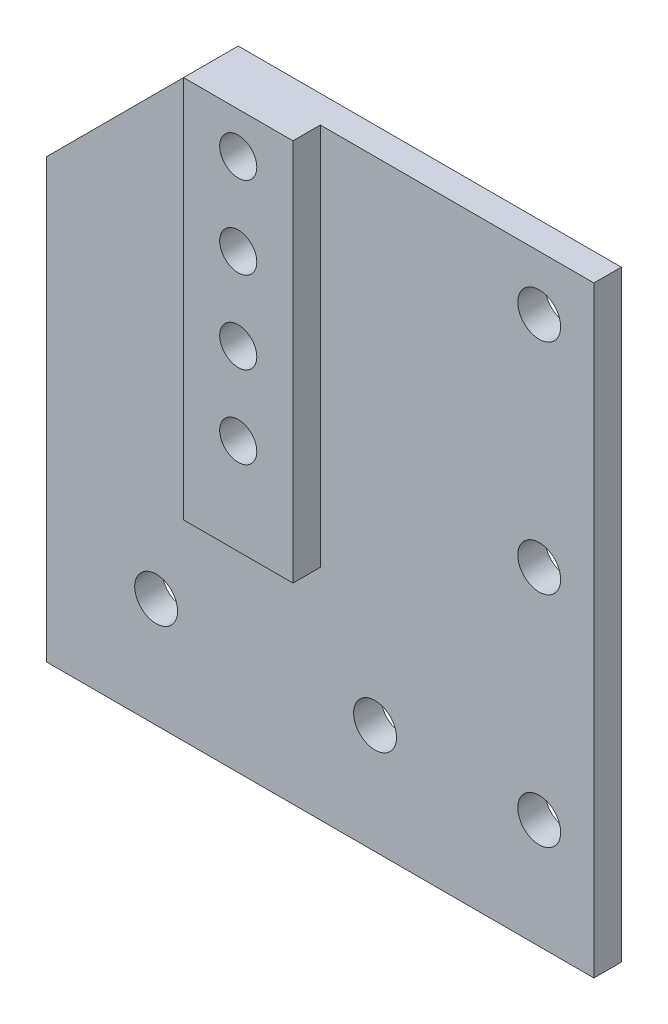
ISO-10303-21;
HEADER;
FILE_DESCRIPTION(('STEP AP214'),'2;1');
FILE_NAME('part.step','',(''),(''),'','','');
FILE_SCHEMA(('AUTOMOTIVE_DESIGN { 1 0 10303 214 1 1 1 1 }'));
ENDSEC;
DATA;
#1=APPLICATION_CONTEXT('core data for automotive mechanical design processes');
#2=APPLICATION_PROTOCOL_DEFINITION('international standard','automotive_design',2000,#1);
#3=PRODUCT_CONTEXT('',#1,'mechanical');
#4=PRODUCT('Part','Part','',(#3));
#5=PRODUCT_RELATED_PRODUCT_CATEGORY('part','',(#4));
#6=PRODUCT_DEFINITION_FORMATION('','',#4);
#7=PRODUCT_DEFINITION_CONTEXT('part definition',#1,'design');
#8=PRODUCT_DEFINITION('design','',#6,#7);
#9=PRODUCT_DEFINITION_SHAPE('','',#8);
#10=(LENGTH_UNIT() NAMED_UNIT(*) SI_UNIT(.MILLI.,.METRE.));
#11=(NAMED_UNIT(*) PLANE_ANGLE_UNIT() SI_UNIT($,.RADIAN.));
#12=(NAMED_UNIT(*) SI_UNIT($,.STERADIAN.) SOLID_ANGLE_UNIT());
#13=UNCERTAINTY_MEASURE_WITH_UNIT(LENGTH_MEASURE(1.E-05),#10,'distance_accuracy_value','');
#14=(GEOMETRIC_REPRESENTATION_CONTEXT(3) GLOBAL_UNCERTAINTY_ASSIGNED_CONTEXT((#13)) GLOBAL_UNIT_ASSIGNED_CONTEXT((#10,
#11,#12)) REPRESENTATION_CONTEXT('',''));
#15=CARTESIAN_POINT('',(0.,0.,0.));
#16=DIRECTION('',(0.,0.,1.));
#17=DIRECTION('',(1.,0.,0.));
#18=AXIS2_PLACEMENT_3D('',#15,#16,#17);
#19=CARTESIAN_POINT('',(0.,0.,3.175));
#20=DIRECTION('',(0.,0.,-1.));
#21=DIRECTION('',(-1.,0.,0.));
#22=AXIS2_PLACEMENT_3D('',#19,#20,#21);
#23=PLANE('',#22);
#24=CARTESIAN_POINT('',(-292.100000508,-4.02802791121815E-12,3.175));
#25=DIRECTION('',(0.,0.,1.));
#26=DIRECTION('',(1.,0.,0.));
#27=AXIS2_PLACEMENT_3D('',#24,#25,#26);
#28=CIRCLE('',#27,2.48919999999997);
#29=CARTESIAN_POINT('',(-289.610800508,-4.02802791121815E-12,3.175));
#30=VERTEX_POINT('',#29);
#31=EDGE_CURVE('E158',#30,#30,#28,.T.);
#32=ORIENTED_EDGE('',*,*,#31,.F.);
#33=EDGE_LOOP('',(#32));
#34=FACE_BOUND('',#33,.T.);
#35=CARTESIAN_POINT('',(-317.500000508,-4.02802791121815E-12,3.175));
#36=DIRECTION('',(0.,0.,1.));
#37=DIRECTION('',(1.,0.,0.));
#38=AXIS2_PLACEMENT_3D('',#35,#36,#37);
#39=CIRCLE('',#38,2.48919999999997);
#40=CARTESIAN_POINT('',(-315.010800508,-4.02802791121815E-12,3.175));
#41=VERTEX_POINT('',#40);
#42=EDGE_CURVE('E152',#41,#41,#39,.T.);
#43=ORIENTED_EDGE('',*,*,#42,.F.);
#44=EDGE_LOOP('',(#43));
#45=FACE_BOUND('',#44,.T.);
#46=CARTESIAN_POINT('',(-273.050000508,1.79465004055551E-11,3.175));
#47=DIRECTION('',(0.,0.,1.));
#48=DIRECTION('',(1.,0.,0.));
#49=AXIS2_PLACEMENT_3D('',#46,#47,#48);
#50=CIRCLE('',#49,2.48919999999997);
#51=CARTESIAN_POINT('',(-270.560800508,1.79465004055551E-11,3.175));
#52=VERTEX_POINT('',#51);
#53=EDGE_CURVE('E146',#52,#52,#50,.T.);
#54=ORIENTED_EDGE('',*,*,#53,.F.);
#55=EDGE_LOOP('',(#54));
#56=FACE_BOUND('',#55,.T.);
#57=CARTESIAN_POINT('',(-273.050000508,25.400000000017,3.175));
#58=DIRECTION('',(0.,0.,1.));
#59=DIRECTION('',(1.,0.,0.));
#60=AXIS2_PLACEMENT_3D('',#57,#58,#59);
#61=CIRCLE('',#60,2.48919999999997);
#62=CARTESIAN_POINT('',(-270.560800508,25.400000000017,3.175));
#63=VERTEX_POINT('',#62);
#64=EDGE_CURVE('E140',#63,#63,#61,.T.);
#65=ORIENTED_EDGE('',*,*,#64,.F.);
#66=EDGE_LOOP('',(#65));
#67=FACE_BOUND('',#66,.T.);
#68=CARTESIAN_POINT('',(-273.050000508,50.8000000000182,3.175));
#69=DIRECTION('',(0.,0.,1.));
#70=DIRECTION('',(1.,0.,0.));
#71=AXIS2_PLACEMENT_3D('',#68,#69,#70);
#72=CIRCLE('',#71,2.48919999999997);
#73=CARTESIAN_POINT('',(-270.560800508,50.8000000000182,3.175));
#74=VERTEX_POINT('',#73);
#75=EDGE_CURVE('E129',#74,#74,#72,.T.);
#76=ORIENTED_EDGE('',*,*,#75,.F.);
#77=EDGE_LOOP('',(#76));
#78=FACE_BOUND('',#77,.T.);
#79=DIRECTION('',(0.,1.,0.));
#80=VECTOR('',#79,1.);
#81=CARTESIAN_POINT('',(-298.450000508,12.6999999999997,3.175));
#82=LINE('',#81,#80);
#83=CARTESIAN_POINT('',(-298.450000508,12.6999999999997,3.175));
#84=VERTEX_POINT('',#83);
#85=CARTESIAN_POINT('',(-298.450000508,57.1499999999997,3.175));
#86=VERTEX_POINT('',#85);
#87=EDGE_CURVE('E52',#84,#86,#82,.T.);
#88=ORIENTED_EDGE('',*,*,#87,.F.);
#89=DIRECTION('',(1.,0.,0.));
#90=VECTOR('',#89,1.);
#91=CARTESIAN_POINT('',(-311.150000508,12.6999999999997,3.175));
#92=LINE('',#91,#90);
#93=CARTESIAN_POINT('',(-311.150000508,12.6999999999997,3.175));
#94=VERTEX_POINT('',#93);
#95=EDGE_CURVE('E211',#94,#84,#92,.T.);
#96=ORIENTED_EDGE('',*,*,#95,.F.);
#97=DIRECTION('',(0.,-1.,0.));
#98=VECTOR('',#97,1.);
#99=CARTESIAN_POINT('',(-311.150000508,57.1499999999997,3.175));
#100=LINE('',#99,#98);
#101=CARTESIAN_POINT('',(-311.150000508,57.1499999999997,3.175));
#102=VERTEX_POINT('',#101);
#103=EDGE_CURVE('E210',#102,#94,#100,.T.);
#104=ORIENTED_EDGE('',*,*,#103,.F.);
#105=DIRECTION('',(-0.707106781186543,-0.707106781186552,0.));
#106=VECTOR('',#105,1.);
#107=CARTESIAN_POINT('',(-311.150000508,57.1499999999997,3.175));
#108=LINE('',#107,#106);
#109=CARTESIAN_POINT('',(-330.200000508,38.0999999999996,3.175));
#110=VERTEX_POINT('',#109);
#111=EDGE_CURVE('E171',#102,#110,#108,.T.);
#112=ORIENTED_EDGE('',*,*,#111,.T.);
#113=DIRECTION('',(0.,-1.,0.));
#114=VECTOR('',#113,1.);
#115=CARTESIAN_POINT('',(-330.200000508,12.6999999999996,3.175));
#116=LINE('',#115,#114);
#117=CARTESIAN_POINT('',(-330.200000508,-12.7000000000004,3.175));
#118=VERTEX_POINT('',#117);
#119=EDGE_CURVE('E173',#110,#118,#116,.T.);
#120=ORIENTED_EDGE('',*,*,#119,.T.);
#121=DIRECTION('',(1.,0.,0.));
#122=VECTOR('',#121,1.);
#123=CARTESIAN_POINT('',(-279.400000508,-12.7000000000001,3.175));
#124=LINE('',#123,#122);
#125=CARTESIAN_POINT('',(-266.700000508,-12.7,3.175));
#126=VERTEX_POINT('',#125);
#127=EDGE_CURVE('E165',#118,#126,#124,.T.);
#128=ORIENTED_EDGE('',*,*,#127,.T.);
#129=DIRECTION('',(0.,1.,0.));
#130=VECTOR('',#129,1.);
#131=CARTESIAN_POINT('',(-266.700000508,-12.7,3.175));
#132=LINE('',#131,#130);
#133=CARTESIAN_POINT('',(-266.700000508,57.1499999999999,3.175));
#134=VERTEX_POINT('',#133);
#135=EDGE_CURVE('E167',#126,#134,#132,.T.);
#136=ORIENTED_EDGE('',*,*,#135,.T.);
#137=DIRECTION('',(-1.,0.,0.));
#138=VECTOR('',#137,1.);
#139=CARTESIAN_POINT('',(-266.700000508,57.1499999999999,3.175));
#140=LINE('',#139,#138);
#141=EDGE_CURVE('E57',#134,#86,#140,.T.);
#142=ORIENTED_EDGE('',*,*,#141,.T.);
#143=EDGE_LOOP('',(#88,#96,#104,#112,#120,#128,#136,#142));
#144=FACE_BOUND('',#143,.T.);
#145=ADVANCED_FACE('F37',(#34,#45,#56,#67,#78,#144),#23,.F.);
#146=CARTESIAN_POINT('',(-279.400000508,-12.7000000000001,3.175));
#147=DIRECTION('',(0.,1.,0.));
#148=DIRECTION('',(-1.,0.,0.));
#149=AXIS2_PLACEMENT_3D('',#146,#147,#148);
#150=PLANE('',#149);
#151=DIRECTION('',(1.,0.,0.));
#152=VECTOR('',#151,1.);
#153=CARTESIAN_POINT('',(-279.400000508,-12.7000000000001,0.));
#154=LINE('',#153,#152);
#155=CARTESIAN_POINT('',(-330.200000508,-12.7000000000004,0.));
#156=VERTEX_POINT('',#155);
#157=CARTESIAN_POINT('',(-266.700000508,-12.7,0.));
#158=VERTEX_POINT('',#157);
#159=EDGE_CURVE('E164',#156,#158,#154,.T.);
#160=ORIENTED_EDGE('',*,*,#159,.T.);
#161=DIRECTION('',(0.,0.,-1.));
#162=VECTOR('',#161,1.);
#163=CARTESIAN_POINT('',(-266.700000508,-12.7,3.175));
#164=LINE('',#163,#162);
#165=EDGE_CURVE('E11',#126,#158,#164,.T.);
#166=ORIENTED_EDGE('',*,*,#165,.F.);
#167=ORIENTED_EDGE('',*,*,#127,.F.);
#168=DIRECTION('',(0.,0.,-1.));
#169=VECTOR('',#168,1.);
#170=CARTESIAN_POINT('',(-330.200000508,-12.7000000000004,3.175));
#171=LINE('',#170,#169);
#172=EDGE_CURVE('E175',#118,#156,#171,.T.);
#173=ORIENTED_EDGE('',*,*,#172,.T.);
#174=EDGE_LOOP('',(#160,#166,#167,#173));
#175=FACE_BOUND('',#174,.T.);
#176=ADVANCED_FACE('F39',(#175),#150,.F.);
#177=CARTESIAN_POINT('',(-266.700000508,-12.7,3.175));
#178=DIRECTION('',(-1.,0.,0.));
#179=DIRECTION('',(0.,-1.,0.));
#180=AXIS2_PLACEMENT_3D('',#177,#178,#179);
#181=PLANE('',#180);
#182=DIRECTION('',(0.,1.,0.));
#183=VECTOR('',#182,1.);
#184=CARTESIAN_POINT('',(-266.700000508,-12.7,0.));
#185=LINE('',#184,#183);
#186=CARTESIAN_POINT('',(-266.700000508,57.1499999999999,0.));
#187=VERTEX_POINT('',#186);
#188=EDGE_CURVE('E177',#158,#187,#185,.T.);
#189=ORIENTED_EDGE('',*,*,#188,.T.);
#190=DIRECTION('',(0.,0.,-1.));
#191=VECTOR('',#190,1.);
#192=CARTESIAN_POINT('',(-266.700000508,57.1499999999999,3.175));
#193=LINE('',#192,#191);
#194=EDGE_CURVE('E45',#134,#187,#193,.T.);
#195=ORIENTED_EDGE('',*,*,#194,.F.);
#196=ORIENTED_EDGE('',*,*,#135,.F.);
#197=ORIENTED_EDGE('',*,*,#165,.T.);
#198=EDGE_LOOP('',(#189,#195,#196,#197));
#199=FACE_BOUND('',#198,.T.);
#200=ADVANCED_FACE('F196',(#199),#181,.F.);
#201=CARTESIAN_POINT('',(-279.400000508,57.1499999999999,3.175));
#202=DIRECTION('',(0.,-1.,0.));
#203=DIRECTION('',(1.,0.,0.));
#204=AXIS2_PLACEMENT_3D('',#201,#202,#203);
#205=PLANE('',#204);
#206=DIRECTION('',(-1.,0.,0.));
#207=VECTOR('',#206,1.);
#208=CARTESIAN_POINT('',(-279.400000508,57.1499999999999,0.));
#209=LINE('',#208,#207);
#210=CARTESIAN_POINT('',(-311.150000508,57.1499999999997,0.));
#211=VERTEX_POINT('',#210);
#212=EDGE_CURVE('E180',#187,#211,#209,.T.);
#213=ORIENTED_EDGE('',*,*,#212,.T.);
#214=DIRECTION('',(0.,0.,-1.));
#215=VECTOR('',#214,1.);
#216=CARTESIAN_POINT('',(-311.150000508,57.1499999999997,3.175));
#217=LINE('',#216,#215);
#218=EDGE_CURVE('E127',#102,#211,#217,.T.);
#219=ORIENTED_EDGE('',*,*,#218,.F.);
#220=DIRECTION('',(0.,0.,-1.));
#221=VECTOR('',#220,1.);
#222=CARTESIAN_POINT('',(-311.150000508,57.1499999999997,6.35));
#223=LINE('',#222,#221);
#224=CARTESIAN_POINT('',(-311.150000508,57.1499999999997,6.35));
#225=VERTEX_POINT('',#224);
#226=EDGE_CURVE('E108',#225,#102,#223,.T.);
#227=ORIENTED_EDGE('',*,*,#226,.F.);
#228=DIRECTION('',(-1.,0.,0.));
#229=VECTOR('',#228,1.);
#230=CARTESIAN_POINT('',(-298.450000508,57.1499999999999,6.35));
#231=LINE('',#230,#229);
#232=CARTESIAN_POINT('',(-298.450000508,57.1499999999999,6.35));
#233=VERTEX_POINT('',#232);
#234=EDGE_CURVE('E114',#233,#225,#231,.T.);
#235=ORIENTED_EDGE('',*,*,#234,.F.);
#236=DIRECTION('',(0.,0.,-1.));
#237=VECTOR('',#236,1.);
#238=CARTESIAN_POINT('',(-298.450000508,57.1499999999999,6.35));
#239=LINE('',#238,#237);
#240=EDGE_CURVE('E222',#233,#86,#239,.T.);
#241=ORIENTED_EDGE('',*,*,#240,.T.);
#242=ORIENTED_EDGE('',*,*,#141,.F.);
#243=ORIENTED_EDGE('',*,*,#194,.T.);
#244=EDGE_LOOP('',(#213,#219,#227,#235,#241,#242,#243));
#245=FACE_BOUND('',#244,.T.);
#246=ADVANCED_FACE('F125',(#245),#205,.F.);
#247=CARTESIAN_POINT('',(-311.150000508,57.1499999999997,3.175));
#248=DIRECTION('',(0.707106781186552,-0.707106781186543,0.));
#249=DIRECTION('',(0.707106781186543,0.707106781186552,0.));
#250=AXIS2_PLACEMENT_3D('',#247,#248,#249);
#251=PLANE('',#250);
#252=DIRECTION('',(-0.707106781186543,-0.707106781186552,0.));
#253=VECTOR('',#252,1.);
#254=CARTESIAN_POINT('',(-311.150000508,57.1499999999997,0.));
#255=LINE('',#254,#253);
#256=CARTESIAN_POINT('',(-330.200000508,38.0999999999996,0.));
#257=VERTEX_POINT('',#256);
#258=EDGE_CURVE('E182',#211,#257,#255,.T.);
#259=ORIENTED_EDGE('',*,*,#258,.T.);
#260=DIRECTION('',(0.,0.,-1.));
#261=VECTOR('',#260,1.);
#262=CARTESIAN_POINT('',(-330.200000508,38.0999999999996,3.175));
#263=LINE('',#262,#261);
#264=EDGE_CURVE('E189',#110,#257,#263,.T.);
#265=ORIENTED_EDGE('',*,*,#264,.F.);
#266=ORIENTED_EDGE('',*,*,#111,.F.);
#267=ORIENTED_EDGE('',*,*,#218,.T.);
#268=EDGE_LOOP('',(#259,#265,#266,#267));
#269=FACE_BOUND('',#268,.T.);
#270=ADVANCED_FACE('F204',(#269),#251,.F.);
#271=CARTESIAN_POINT('',(-330.200000508,-12.7000000000004,3.175));
#272=DIRECTION('',(1.,0.,0.));
#273=DIRECTION('',(0.,1.,0.));
#274=AXIS2_PLACEMENT_3D('',#271,#272,#273);
#275=PLANE('',#274);
#276=DIRECTION('',(0.,-1.,0.));
#277=VECTOR('',#276,1.);
#278=CARTESIAN_POINT('',(-330.200000508,-12.7000000000004,0.));
#279=LINE('',#278,#277);
#280=EDGE_CURVE('E168',#257,#156,#279,.T.);
#281=ORIENTED_EDGE('',*,*,#280,.T.);
#282=ORIENTED_EDGE('',*,*,#172,.F.);
#283=ORIENTED_EDGE('',*,*,#119,.F.);
#284=ORIENTED_EDGE('',*,*,#264,.T.);
#285=EDGE_LOOP('',(#281,#282,#283,#284));
#286=FACE_BOUND('',#285,.T.);
#287=ADVANCED_FACE('F207',(#286),#275,.F.);
#288=CARTESIAN_POINT('',(0.,0.,0.));
#289=DIRECTION('',(0.,0.,-1.));
#290=DIRECTION('',(-1.,0.,0.));
#291=AXIS2_PLACEMENT_3D('',#288,#289,#290);
#292=PLANE('',#291);
#293=CARTESIAN_POINT('',(-304.800000508,42.8624999999998,0.));
#294=DIRECTION('',(0.,0.,1.));
#295=DIRECTION('',(1.,0.,0.));
#296=AXIS2_PLACEMENT_3D('',#293,#294,#295);
#297=CIRCLE('',#296,2.15264999999998);
#298=CARTESIAN_POINT('',(-302.647350508,42.8624999999998,0.));
#299=VERTEX_POINT('',#298);
#300=EDGE_CURVE('E244',#299,#299,#297,.T.);
#301=ORIENTED_EDGE('',*,*,#300,.T.);
#302=EDGE_LOOP('',(#301));
#303=FACE_BOUND('',#302,.T.);
#304=CARTESIAN_POINT('',(-304.800000508,52.3874999999998,0.));
#305=DIRECTION('',(0.,0.,1.));
#306=DIRECTION('',(1.,0.,0.));
#307=AXIS2_PLACEMENT_3D('',#304,#305,#306);
#308=CIRCLE('',#307,2.15264999999998);
#309=CARTESIAN_POINT('',(-302.647350508,52.3874999999998,0.));
#310=VERTEX_POINT('',#309);
#311=EDGE_CURVE('E238',#310,#310,#308,.T.);
#312=ORIENTED_EDGE('',*,*,#311,.T.);
#313=EDGE_LOOP('',(#312));
#314=FACE_BOUND('',#313,.T.);
#315=CARTESIAN_POINT('',(-304.800000508,33.3374999999998,0.));
#316=DIRECTION('',(0.,0.,1.));
#317=DIRECTION('',(1.,0.,0.));
#318=AXIS2_PLACEMENT_3D('',#315,#316,#317);
#319=CIRCLE('',#318,2.15264999999998);
#320=CARTESIAN_POINT('',(-302.647350508,33.3374999999998,0.));
#321=VERTEX_POINT('',#320);
#322=EDGE_CURVE('E232',#321,#321,#319,.T.);
#323=ORIENTED_EDGE('',*,*,#322,.T.);
#324=EDGE_LOOP('',(#323));
#325=FACE_BOUND('',#324,.T.);
#326=CARTESIAN_POINT('',(-304.800000508,23.8124999999998,0.));
#327=DIRECTION('',(0.,0.,1.));
#328=DIRECTION('',(1.,0.,0.));
#329=AXIS2_PLACEMENT_3D('',#326,#327,#328);
#330=CIRCLE('',#329,2.15264999999998);
#331=CARTESIAN_POINT('',(-302.647350508,23.8124999999998,0.));
#332=VERTEX_POINT('',#331);
#333=EDGE_CURVE('E212',#332,#332,#330,.T.);
#334=ORIENTED_EDGE('',*,*,#333,.T.);
#335=EDGE_LOOP('',(#334));
#336=FACE_BOUND('',#335,.T.);
#337=CARTESIAN_POINT('',(-273.050000508,50.8000000000182,0.));
#338=DIRECTION('',(0.,0.,1.));
#339=DIRECTION('',(1.,0.,0.));
#340=AXIS2_PLACEMENT_3D('',#337,#338,#339);
#341=CIRCLE('',#340,2.48920000000002);
#342=CARTESIAN_POINT('',(-270.560800508,50.8000000000182,0.));
#343=VERTEX_POINT('',#342);
#344=EDGE_CURVE('E132',#343,#343,#341,.T.);
#345=ORIENTED_EDGE('',*,*,#344,.T.);
#346=EDGE_LOOP('',(#345));
#347=FACE_BOUND('',#346,.T.);
#348=CARTESIAN_POINT('',(-273.050000508,25.400000000017,0.));
#349=DIRECTION('',(0.,0.,1.));
#350=DIRECTION('',(1.,0.,0.));
#351=AXIS2_PLACEMENT_3D('',#348,#349,#350);
#352=CIRCLE('',#351,2.48920000000002);
#353=CARTESIAN_POINT('',(-270.560800508,25.400000000017,0.));
#354=VERTEX_POINT('',#353);
#355=EDGE_CURVE('E143',#354,#354,#352,.T.);
#356=ORIENTED_EDGE('',*,*,#355,.T.);
#357=EDGE_LOOP('',(#356));
#358=FACE_BOUND('',#357,.T.);
#359=CARTESIAN_POINT('',(-273.050000508,1.79465004055551E-11,0.));
#360=DIRECTION('',(0.,0.,1.));
#361=DIRECTION('',(1.,0.,0.));
#362=AXIS2_PLACEMENT_3D('',#359,#360,#361);
#363=CIRCLE('',#362,2.48920000000002);
#364=CARTESIAN_POINT('',(-270.560800508,1.79465004055551E-11,0.));
#365=VERTEX_POINT('',#364);
#366=EDGE_CURVE('E149',#365,#365,#363,.T.);
#367=ORIENTED_EDGE('',*,*,#366,.T.);
#368=EDGE_LOOP('',(#367));
#369=FACE_BOUND('',#368,.T.);
#370=CARTESIAN_POINT('',(-317.500000508,-4.02802791121815E-12,0.));
#371=DIRECTION('',(0.,0.,1.));
#372=DIRECTION('',(1.,0.,0.));
#373=AXIS2_PLACEMENT_3D('',#370,#371,#372);
#374=CIRCLE('',#373,2.48920000000002);
#375=CARTESIAN_POINT('',(-315.010800508,-4.02802791121815E-12,0.));
#376=VERTEX_POINT('',#375);
#377=EDGE_CURVE('E155',#376,#376,#374,.T.);
#378=ORIENTED_EDGE('',*,*,#377,.T.);
#379=EDGE_LOOP('',(#378));
#380=FACE_BOUND('',#379,.T.);
#381=CARTESIAN_POINT('',(-292.100000508,-4.02802791121815E-12,0.));
#382=DIRECTION('',(0.,0.,1.));
#383=DIRECTION('',(1.,0.,0.));
#384=AXIS2_PLACEMENT_3D('',#381,#382,#383);
#385=CIRCLE('',#384,2.48920000000002);
#386=CARTESIAN_POINT('',(-289.610800508,-4.02802791121815E-12,0.));
#387=VERTEX_POINT('',#386);
#388=EDGE_CURVE('E161',#387,#387,#385,.T.);
#389=ORIENTED_EDGE('',*,*,#388,.T.);
#390=EDGE_LOOP('',(#389));
#391=FACE_BOUND('',#390,.T.);
#392=ORIENTED_EDGE('',*,*,#159,.F.);
#393=ORIENTED_EDGE('',*,*,#280,.F.);
#394=ORIENTED_EDGE('',*,*,#258,.F.);
#395=ORIENTED_EDGE('',*,*,#212,.F.);
#396=ORIENTED_EDGE('',*,*,#188,.F.);
#397=EDGE_LOOP('',(#392,#393,#394,#395,#396));
#398=FACE_BOUND('',#397,.T.);
#399=ADVANCED_FACE('F200',(#303,#314,#325,#336,#347,#358,#369,#380,#391,#398),#292,.T.);
#400=CARTESIAN_POINT('',(-292.100000508,-4.02802791121815E-12,3.175));
#401=DIRECTION('',(0.,0.,1.));
#402=DIRECTION('',(1.,0.,0.));
#403=AXIS2_PLACEMENT_3D('',#400,#401,#402);
#404=CYLINDRICAL_SURFACE('',#403,2.4892);
#405=ORIENTED_EDGE('',*,*,#388,.F.);
#406=EDGE_LOOP('',(#405));
#407=FACE_BOUND('',#406,.T.);
#408=ORIENTED_EDGE('',*,*,#31,.T.);
#409=EDGE_LOOP('',(#408));
#410=FACE_BOUND('',#409,.T.);
#411=ADVANCED_FACE('F285',(#407,#410),#404,.F.);
#412=CARTESIAN_POINT('',(-317.500000508,-4.02802791121815E-12,3.175));
#413=DIRECTION('',(0.,0.,1.));
#414=DIRECTION('',(1.,0.,0.));
#415=AXIS2_PLACEMENT_3D('',#412,#413,#414);
#416=CYLINDRICAL_SURFACE('',#415,2.4892);
#417=ORIENTED_EDGE('',*,*,#377,.F.);
#418=EDGE_LOOP('',(#417));
#419=FACE_BOUND('',#418,.T.);
#420=ORIENTED_EDGE('',*,*,#42,.T.);
#421=EDGE_LOOP('',(#420));
#422=FACE_BOUND('',#421,.T.);
#423=ADVANCED_FACE('F325',(#419,#422),#416,.F.);
#424=CARTESIAN_POINT('',(-273.050000508,1.79465004055551E-11,3.175));
#425=DIRECTION('',(0.,0.,1.));
#426=DIRECTION('',(1.,0.,0.));
#427=AXIS2_PLACEMENT_3D('',#424,#425,#426);
#428=CYLINDRICAL_SURFACE('',#427,2.4892);
#429=ORIENTED_EDGE('',*,*,#366,.F.);
#430=EDGE_LOOP('',(#429));
#431=FACE_BOUND('',#430,.T.);
#432=ORIENTED_EDGE('',*,*,#53,.T.);
#433=EDGE_LOOP('',(#432));
#434=FACE_BOUND('',#433,.T.);
#435=ADVANCED_FACE('F332',(#431,#434),#428,.F.);
#436=CARTESIAN_POINT('',(-273.050000508,25.400000000017,3.175));
#437=DIRECTION('',(0.,0.,1.));
#438=DIRECTION('',(1.,0.,0.));
#439=AXIS2_PLACEMENT_3D('',#436,#437,#438);
#440=CYLINDRICAL_SURFACE('',#439,2.4892);
#441=ORIENTED_EDGE('',*,*,#355,.F.);
#442=EDGE_LOOP('',(#441));
#443=FACE_BOUND('',#442,.T.);
#444=ORIENTED_EDGE('',*,*,#64,.T.);
#445=EDGE_LOOP('',(#444));
#446=FACE_BOUND('',#445,.T.);
#447=ADVANCED_FACE('F339',(#443,#446),#440,.F.);
#448=CARTESIAN_POINT('',(-273.050000508,50.8000000000182,3.175));
#449=DIRECTION('',(0.,0.,1.));
#450=DIRECTION('',(1.,0.,0.));
#451=AXIS2_PLACEMENT_3D('',#448,#449,#450);
#452=CYLINDRICAL_SURFACE('',#451,2.4892);
#453=ORIENTED_EDGE('',*,*,#344,.F.);
#454=EDGE_LOOP('',(#453));
#455=FACE_BOUND('',#454,.T.);
#456=ORIENTED_EDGE('',*,*,#75,.T.);
#457=EDGE_LOOP('',(#456));
#458=FACE_BOUND('',#457,.T.);
#459=ADVANCED_FACE('F347',(#455,#458),#452,.F.);
#460=CARTESIAN_POINT('',(-311.150000508,57.1499999999997,6.35));
#461=DIRECTION('',(1.,0.,0.));
#462=DIRECTION('',(0.,0.,-1.));
#463=AXIS2_PLACEMENT_3D('',#460,#461,#462);
#464=PLANE('',#463);
#465=ORIENTED_EDGE('',*,*,#103,.T.);
#466=DIRECTION('',(0.,0.,-1.));
#467=VECTOR('',#466,1.);
#468=CARTESIAN_POINT('',(-311.150000508,12.6999999999997,6.35));
#469=LINE('',#468,#467);
#470=CARTESIAN_POINT('',(-311.150000508,12.6999999999997,6.35));
#471=VERTEX_POINT('',#470);
#472=EDGE_CURVE('E110',#471,#94,#469,.T.);
#473=ORIENTED_EDGE('',*,*,#472,.F.);
#474=DIRECTION('',(0.,-1.,0.));
#475=VECTOR('',#474,1.);
#476=CARTESIAN_POINT('',(-311.150000508,57.1499999999997,6.35));
#477=LINE('',#476,#475);
#478=EDGE_CURVE('E103',#225,#471,#477,.T.);
#479=ORIENTED_EDGE('',*,*,#478,.F.);
#480=ORIENTED_EDGE('',*,*,#226,.T.);
#481=EDGE_LOOP('',(#465,#473,#479,#480));
#482=FACE_BOUND('',#481,.T.);
#483=ADVANCED_FACE('F106',(#482),#464,.F.);
#484=CARTESIAN_POINT('',(-311.150000508,12.6999999999997,6.35));
#485=DIRECTION('',(0.,1.,0.));
#486=DIRECTION('',(-1.,0.,0.));
#487=AXIS2_PLACEMENT_3D('',#484,#485,#486);
#488=PLANE('',#487);
#489=ORIENTED_EDGE('',*,*,#95,.T.);
#490=DIRECTION('',(0.,0.,-1.));
#491=VECTOR('',#490,1.);
#492=CARTESIAN_POINT('',(-298.450000508,12.6999999999997,6.35));
#493=LINE('',#492,#491);
#494=CARTESIAN_POINT('',(-298.450000508,12.6999999999997,6.35));
#495=VERTEX_POINT('',#494);
#496=EDGE_CURVE('E134',#495,#84,#493,.T.);
#497=ORIENTED_EDGE('',*,*,#496,.F.);
#498=DIRECTION('',(1.,0.,0.));
#499=VECTOR('',#498,1.);
#500=CARTESIAN_POINT('',(-311.150000508,12.6999999999997,6.35));
#501=LINE('',#500,#499);
#502=EDGE_CURVE('E113',#471,#495,#501,.T.);
#503=ORIENTED_EDGE('',*,*,#502,.F.);
#504=ORIENTED_EDGE('',*,*,#472,.T.);
#505=EDGE_LOOP('',(#489,#497,#503,#504));
#506=FACE_BOUND('',#505,.T.);
#507=ADVANCED_FACE('F228',(#506),#488,.F.);
#508=CARTESIAN_POINT('',(-298.450000508,12.6999999999997,6.35));
#509=DIRECTION('',(-1.,0.,0.));
#510=DIRECTION('',(0.,0.,1.));
#511=AXIS2_PLACEMENT_3D('',#508,#509,#510);
#512=PLANE('',#511);
#513=ORIENTED_EDGE('',*,*,#87,.T.);
#514=ORIENTED_EDGE('',*,*,#240,.F.);
#515=DIRECTION('',(0.,1.,0.));
#516=VECTOR('',#515,1.);
#517=CARTESIAN_POINT('',(-298.450000508,12.6999999999997,6.35));
#518=LINE('',#517,#516);
#519=EDGE_CURVE('E119',#495,#233,#518,.T.);
#520=ORIENTED_EDGE('',*,*,#519,.F.);
#521=ORIENTED_EDGE('',*,*,#496,.T.);
#522=EDGE_LOOP('',(#513,#514,#520,#521));
#523=FACE_BOUND('',#522,.T.);
#524=ADVANCED_FACE('F226',(#523),#512,.F.);
#525=CARTESIAN_POINT('',(0.,0.,6.35));
#526=DIRECTION('',(0.,0.,1.));
#527=DIRECTION('',(1.,0.,0.));
#528=AXIS2_PLACEMENT_3D('',#525,#526,#527);
#529=PLANE('',#528);
#530=CARTESIAN_POINT('',(-304.800000508,42.8624999999998,6.35));
#531=DIRECTION('',(0.,0.,1.));
#532=DIRECTION('',(1.,0.,0.));
#533=AXIS2_PLACEMENT_3D('',#530,#531,#532);
#534=CIRCLE('',#533,2.15264999999998);
#535=CARTESIAN_POINT('',(-302.647350508,42.8624999999998,6.35));
#536=VERTEX_POINT('',#535);
#537=EDGE_CURVE('E247',#536,#536,#534,.T.);
#538=ORIENTED_EDGE('',*,*,#537,.F.);
#539=EDGE_LOOP('',(#538));
#540=FACE_BOUND('',#539,.T.);
#541=CARTESIAN_POINT('',(-304.800000508,52.3874999999998,6.35));
#542=DIRECTION('',(0.,0.,1.));
#543=DIRECTION('',(1.,0.,0.));
#544=AXIS2_PLACEMENT_3D('',#541,#542,#543);
#545=CIRCLE('',#544,2.15264999999998);
#546=CARTESIAN_POINT('',(-302.647350508,52.3874999999998,6.35));
#547=VERTEX_POINT('',#546);
#548=EDGE_CURVE('E241',#547,#547,#545,.T.);
#549=ORIENTED_EDGE('',*,*,#548,.F.);
#550=EDGE_LOOP('',(#549));
#551=FACE_BOUND('',#550,.T.);
#552=CARTESIAN_POINT('',(-304.800000508,33.3374999999998,6.35));
#553=DIRECTION('',(0.,0.,1.));
#554=DIRECTION('',(1.,0.,0.));
#555=AXIS2_PLACEMENT_3D('',#552,#553,#554);
#556=CIRCLE('',#555,2.15264999999998);
#557=CARTESIAN_POINT('',(-302.647350508,33.3374999999998,6.35));
#558=VERTEX_POINT('',#557);
#559=EDGE_CURVE('E235',#558,#558,#556,.T.);
#560=ORIENTED_EDGE('',*,*,#559,.F.);
#561=EDGE_LOOP('',(#560));
#562=FACE_BOUND('',#561,.T.);
#563=CARTESIAN_POINT('',(-304.800000508,23.8124999999998,6.35));
#564=DIRECTION('',(0.,0.,1.));
#565=DIRECTION('',(1.,0.,0.));
#566=AXIS2_PLACEMENT_3D('',#563,#564,#565);
#567=CIRCLE('',#566,2.15264999999998);
#568=CARTESIAN_POINT('',(-302.647350508,23.8124999999998,6.35));
#569=VERTEX_POINT('',#568);
#570=EDGE_CURVE('E216',#569,#569,#567,.T.);
#571=ORIENTED_EDGE('',*,*,#570,.F.);
#572=EDGE_LOOP('',(#571));
#573=FACE_BOUND('',#572,.T.);
#574=ORIENTED_EDGE('',*,*,#234,.T.);
#575=ORIENTED_EDGE('',*,*,#478,.T.);
#576=ORIENTED_EDGE('',*,*,#502,.T.);
#577=ORIENTED_EDGE('',*,*,#519,.T.);
#578=EDGE_LOOP('',(#574,#575,#576,#577));
#579=FACE_BOUND('',#578,.T.);
#580=ADVANCED_FACE('F117',(#540,#551,#562,#573,#579),#529,.T.);
#581=CARTESIAN_POINT('',(-304.800000508,23.8124999999998,6.35));
#582=DIRECTION('',(0.,0.,1.));
#583=DIRECTION('',(1.,0.,0.));
#584=AXIS2_PLACEMENT_3D('',#581,#582,#583);
#585=CYLINDRICAL_SURFACE('',#584,2.15264999999998);
#586=ORIENTED_EDGE('',*,*,#333,.F.);
#587=EDGE_LOOP('',(#586));
#588=FACE_BOUND('',#587,.T.);
#589=ORIENTED_EDGE('',*,*,#570,.T.);
#590=EDGE_LOOP('',(#589));
#591=FACE_BOUND('',#590,.T.);
#592=ADVANCED_FACE('F255',(#588,#591),#585,.F.);
#593=CARTESIAN_POINT('',(-304.800000508,33.3374999999998,6.35));
#594=DIRECTION('',(0.,0.,1.));
#595=DIRECTION('',(1.,0.,0.));
#596=AXIS2_PLACEMENT_3D('',#593,#594,#595);
#597=CYLINDRICAL_SURFACE('',#596,2.15264999999998);
#598=ORIENTED_EDGE('',*,*,#322,.F.);
#599=EDGE_LOOP('',(#598));
#600=FACE_BOUND('',#599,.T.);
#601=ORIENTED_EDGE('',*,*,#559,.T.);
#602=EDGE_LOOP('',(#601));
#603=FACE_BOUND('',#602,.T.);
#604=ADVANCED_FACE('F264',(#600,#603),#597,.F.);
#605=CARTESIAN_POINT('',(-304.800000508,52.3874999999998,6.35));
#606=DIRECTION('',(0.,0.,1.));
#607=DIRECTION('',(1.,0.,0.));
#608=AXIS2_PLACEMENT_3D('',#605,#606,#607);
#609=CYLINDRICAL_SURFACE('',#608,2.15264999999998);
#610=ORIENTED_EDGE('',*,*,#311,.F.);
#611=EDGE_LOOP('',(#610));
#612=FACE_BOUND('',#611,.T.);
#613=ORIENTED_EDGE('',*,*,#548,.T.);
#614=EDGE_LOOP('',(#613));
#615=FACE_BOUND('',#614,.T.);
#616=ADVANCED_FACE('F270',(#612,#615),#609,.F.);
#617=CARTESIAN_POINT('',(-304.800000508,42.8624999999998,6.35));
#618=DIRECTION('',(0.,0.,1.));
#619=DIRECTION('',(1.,0.,0.));
#620=AXIS2_PLACEMENT_3D('',#617,#618,#619);
#621=CYLINDRICAL_SURFACE('',#620,2.15264999999998);
#622=ORIENTED_EDGE('',*,*,#300,.F.);
#623=EDGE_LOOP('',(#622));
#624=FACE_BOUND('',#623,.T.);
#625=ORIENTED_EDGE('',*,*,#537,.T.);
#626=EDGE_LOOP('',(#625));
#627=FACE_BOUND('',#626,.T.);
#628=ADVANCED_FACE('F251',(#624,#627),#621,.F.);
#629=CLOSED_SHELL('',(#145,#176,#200,#246,#270,#287,#399,#411,#423,#435,#447,#459,#483,#507,
#524,#580,#592,#604,#616,#628));
#630=MANIFOLD_SOLID_BREP('B2',#629);
#631=ADVANCED_BREP_SHAPE_REPRESENTATION('',(#18,#630),#14);
#632=SHAPE_DEFINITION_REPRESENTATION(#9,#631);
ENDSEC;
END-ISO-10303-21;
